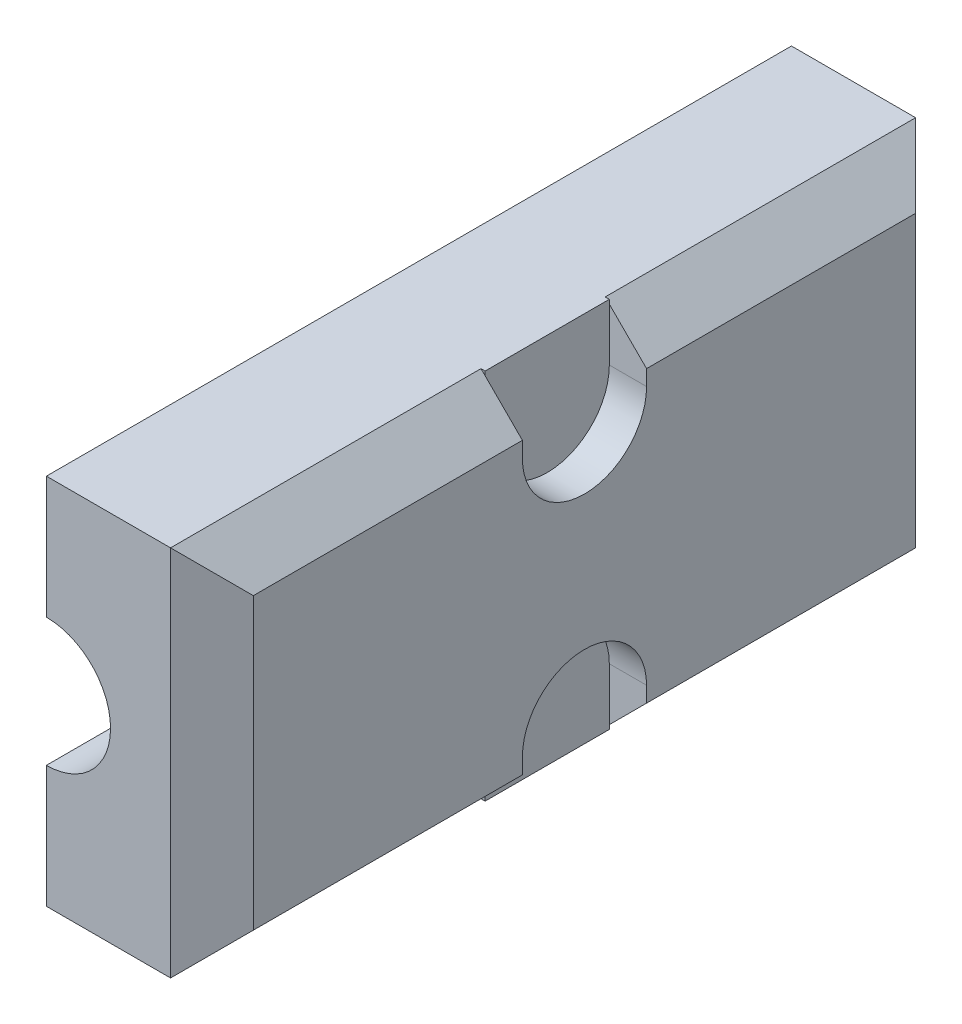
ISO-10303-21;
HEADER;
FILE_DESCRIPTION(('STEP AP214'),'2;1');
FILE_NAME('part.step','',(''),(''),'','','');
FILE_SCHEMA(('AUTOMOTIVE_DESIGN { 1 0 10303 214 1 1 1 1 }'));
ENDSEC;
DATA;
#1=APPLICATION_CONTEXT('core data for automotive mechanical design processes');
#2=APPLICATION_PROTOCOL_DEFINITION('international standard','automotive_design',2000,#1);
#3=PRODUCT_CONTEXT('',#1,'mechanical');
#4=PRODUCT('Part','Part','',(#3));
#5=PRODUCT_RELATED_PRODUCT_CATEGORY('part','',(#4));
#6=PRODUCT_DEFINITION_FORMATION('','',#4);
#7=PRODUCT_DEFINITION_CONTEXT('part definition',#1,'design');
#8=PRODUCT_DEFINITION('design','',#6,#7);
#9=PRODUCT_DEFINITION_SHAPE('','',#8);
#10=(LENGTH_UNIT() NAMED_UNIT(*) SI_UNIT(.MILLI.,.METRE.));
#11=(NAMED_UNIT(*) PLANE_ANGLE_UNIT() SI_UNIT($,.RADIAN.));
#12=(NAMED_UNIT(*) SI_UNIT($,.STERADIAN.) SOLID_ANGLE_UNIT());
#13=UNCERTAINTY_MEASURE_WITH_UNIT(LENGTH_MEASURE(1.E-05),#10,'distance_accuracy_value','');
#14=(GEOMETRIC_REPRESENTATION_CONTEXT(3) GLOBAL_UNCERTAINTY_ASSIGNED_CONTEXT((#13)) GLOBAL_UNIT_ASSIGNED_CONTEXT((#10,
#11,#12)) REPRESENTATION_CONTEXT('',''));
#15=CARTESIAN_POINT('',(0.,0.,0.));
#16=DIRECTION('',(0.,0.,1.));
#17=DIRECTION('',(1.,0.,0.));
#18=AXIS2_PLACEMENT_3D('',#15,#16,#17);
#19=CARTESIAN_POINT('',(8.,7.,0.));
#20=DIRECTION('',(-0.707106781186546,-0.707106781186549,0.));
#21=DIRECTION('',(0.,0.,1.));
#22=AXIS2_PLACEMENT_3D('',#19,#20,#21);
#23=PLANE('',#22);
#24=DIRECTION('',(0.,0.,1.));
#25=VECTOR('',#24,1.);
#26=CARTESIAN_POINT('',(8.,7.,0.));
#27=LINE('',#26,#25);
#28=CARTESIAN_POINT('',(8.,7.,2.99999999999994));
#29=VERTEX_POINT('',#28);
#30=CARTESIAN_POINT('',(8.,7.,16.));
#31=VERTEX_POINT('',#30);
#32=EDGE_CURVE('E290',#29,#31,#27,.T.);
#33=ORIENTED_EDGE('',*,*,#32,.F.);
#34=DIRECTION('',(0.707106781186549,-0.707106781186546,0.));
#35=VECTOR('',#34,1.);
#36=CARTESIAN_POINT('',(8.,7.,2.99999999999994));
#37=LINE('',#36,#35);
#38=CARTESIAN_POINT('',(6.2,8.79999999999999,2.99999999999994));
#39=VERTEX_POINT('',#38);
#40=EDGE_CURVE('E334',#29,#39,#37,.F.);
#41=ORIENTED_EDGE('',*,*,#40,.T.);
#42=CARTESIAN_POINT('',(6.,9.,2.99999999999994));
#43=VERTEX_POINT('',#42);
#44=EDGE_CURVE('E333',#39,#43,#37,.F.);
#45=ORIENTED_EDGE('',*,*,#44,.T.);
#46=DIRECTION('',(0.,0.,-1.));
#47=VECTOR('',#46,1.);
#48=CARTESIAN_POINT('',(5.99999999999999,9.,18.));
#49=LINE('',#48,#47);
#50=CARTESIAN_POINT('',(5.99999999999999,9.,18.));
#51=VERTEX_POINT('',#50);
#52=EDGE_CURVE('E312',#51,#43,#49,.T.);
#53=ORIENTED_EDGE('',*,*,#52,.F.);
#54=DIRECTION('',(0.577350269189627,-0.577350269189625,-0.577350269189625));
#55=VECTOR('',#54,1.);
#56=CARTESIAN_POINT('',(13.3333333333333,1.66666666666668,10.6666666666667));
#57=LINE('',#56,#55);
#58=EDGE_CURVE('E317',#31,#51,#57,.F.);
#59=ORIENTED_EDGE('',*,*,#58,.F.);
#60=EDGE_LOOP('',(#33,#41,#45,#53,#59));
#61=FACE_BOUND('',#60,.T.);
#62=ADVANCED_FACE('F38',(#61),#23,.F.);
#63=CARTESIAN_POINT('',(8.,-7.,0.));
#64=DIRECTION('',(-0.707106781186546,0.707106781186549,0.));
#65=DIRECTION('',(0.,0.,-1.));
#66=AXIS2_PLACEMENT_3D('',#63,#64,#65);
#67=PLANE('',#66);
#68=DIRECTION('',(0.,0.,-1.));
#69=VECTOR('',#68,1.);
#70=CARTESIAN_POINT('',(8.,-7.,0.));
#71=LINE('',#70,#69);
#72=CARTESIAN_POINT('',(8.,-7.,-3.00000000000006));
#73=VERTEX_POINT('',#72);
#74=CARTESIAN_POINT('',(8.,-7.,-16.));
#75=VERTEX_POINT('',#74);
#76=EDGE_CURVE('E296',#73,#75,#71,.T.);
#77=ORIENTED_EDGE('',*,*,#76,.F.);
#78=DIRECTION('',(0.707106781186549,0.707106781186546,0.));
#79=VECTOR('',#78,1.);
#80=CARTESIAN_POINT('',(8.,-7.,-3.00000000000006));
#81=LINE('',#80,#79);
#82=CARTESIAN_POINT('',(6.2,-8.79999999999999,-3.00000000000006));
#83=VERTEX_POINT('',#82);
#84=EDGE_CURVE('E328',#73,#83,#81,.F.);
#85=ORIENTED_EDGE('',*,*,#84,.T.);
#86=CARTESIAN_POINT('',(6.,-9.,-3.00000000000006));
#87=VERTEX_POINT('',#86);
#88=EDGE_CURVE('E315',#83,#87,#81,.F.);
#89=ORIENTED_EDGE('',*,*,#88,.T.);
#90=DIRECTION('',(0.,0.,1.));
#91=VECTOR('',#90,1.);
#92=CARTESIAN_POINT('',(5.99999999999999,-9.,18.));
#93=LINE('',#92,#91);
#94=CARTESIAN_POINT('',(5.99999999999999,-9.,-18.));
#95=VERTEX_POINT('',#94);
#96=EDGE_CURVE('E307',#95,#87,#93,.T.);
#97=ORIENTED_EDGE('',*,*,#96,.F.);
#98=DIRECTION('',(-0.577350269189627,-0.577350269189625,-0.577350269189625));
#99=VECTOR('',#98,1.);
#100=CARTESIAN_POINT('',(10.3333333333333,-4.66666666666667,-13.6666666666667));
#101=LINE('',#100,#99);
#102=EDGE_CURVE('E319',#95,#75,#101,.F.);
#103=ORIENTED_EDGE('',*,*,#102,.T.);
#104=EDGE_LOOP('',(#77,#85,#89,#97,#103));
#105=FACE_BOUND('',#104,.T.);
#106=ADVANCED_FACE('F403',(#105),#67,.F.);
#107=CARTESIAN_POINT('',(8.88178419700125E-13,-6.24999999999994,0.));
#108=DIRECTION('',(1.,0.,0.));
#109=DIRECTION('',(0.,0.,-1.));
#110=AXIS2_PLACEMENT_3D('',#107,#108,#109);
#111=CYLINDRICAL_SURFACE('',#110,2.);
#112=CARTESIAN_POINT('',(8.88178419700125E-13,-6.24999999999994,0.));
#113=DIRECTION('',(1.00000000000007,0.,0.));
#114=DIRECTION('',(0.,0.,-1.));
#115=AXIS2_PLACEMENT_3D('',#112,#113,#114);
#116=CIRCLE('',#115,2.);
#117=CARTESIAN_POINT('',(8.88178419700125E-13,-6.24999999999994,-2.00000000000002));
#118=VERTEX_POINT('',#117);
#119=EDGE_CURVE('E253',#118,#118,#116,.T.);
#120=ORIENTED_EDGE('',*,*,#119,.F.);
#121=EDGE_LOOP('',(#120));
#122=FACE_BOUND('',#121,.T.);
#123=CARTESIAN_POINT('',(6.,-6.24999999999994,0.));
#124=DIRECTION('',(1.,0.,0.));
#125=DIRECTION('',(0.,0.,-1.));
#126=AXIS2_PLACEMENT_3D('',#123,#124,#125);
#127=CIRCLE('',#126,2.);
#128=CARTESIAN_POINT('',(6.,-6.24999999999994,-2.00000000000002));
#129=VERTEX_POINT('',#128);
#130=EDGE_CURVE('E256',#129,#129,#127,.F.);
#131=ORIENTED_EDGE('',*,*,#130,.F.);
#132=EDGE_LOOP('',(#131));
#133=FACE_BOUND('',#132,.T.);
#134=ADVANCED_FACE('F429',(#122,#133),#111,.F.);
#135=CARTESIAN_POINT('',(0.,6.25000000000007,0.));
#136=DIRECTION('',(1.,0.,0.));
#137=DIRECTION('',(0.,0.,-1.));
#138=AXIS2_PLACEMENT_3D('',#135,#136,#137);
#139=CYLINDRICAL_SURFACE('',#138,2.);
#140=CARTESIAN_POINT('',(0.,6.25000000000007,0.));
#141=DIRECTION('',(1.00000000000001,0.,0.));
#142=DIRECTION('',(0.,0.,-1.));
#143=AXIS2_PLACEMENT_3D('',#140,#141,#142);
#144=CIRCLE('',#143,2.);
#145=CARTESIAN_POINT('',(0.,6.25000000000007,-2.00000000000006));
#146=VERTEX_POINT('',#145);
#147=EDGE_CURVE('E249',#146,#146,#144,.T.);
#148=ORIENTED_EDGE('',*,*,#147,.F.);
#149=EDGE_LOOP('',(#148));
#150=FACE_BOUND('',#149,.T.);
#151=CARTESIAN_POINT('',(6.,6.25000000000007,0.));
#152=DIRECTION('',(1.,0.,0.));
#153=DIRECTION('',(0.,0.,-1.));
#154=AXIS2_PLACEMENT_3D('',#151,#152,#153);
#155=CIRCLE('',#154,2.);
#156=CARTESIAN_POINT('',(6.,6.25000000000007,-2.00000000000006));
#157=VERTEX_POINT('',#156);
#158=EDGE_CURVE('E237',#157,#157,#155,.F.);
#159=ORIENTED_EDGE('',*,*,#158,.F.);
#160=EDGE_LOOP('',(#159));
#161=FACE_BOUND('',#160,.T.);
#162=ADVANCED_FACE('F572',(#150,#161),#139,.F.);
#163=CARTESIAN_POINT('',(0.,0.,0.));
#164=DIRECTION('',(-1.,0.,0.));
#165=DIRECTION('',(0.,0.,1.));
#166=AXIS2_PLACEMENT_3D('',#163,#164,#165);
#167=PLANE('',#166);
#168=ORIENTED_EDGE('',*,*,#119,.T.);
#169=EDGE_LOOP('',(#168));
#170=FACE_BOUND('',#169,.T.);
#171=DIRECTION('',(0.,0.,1.));
#172=VECTOR('',#171,1.);
#173=CARTESIAN_POINT('',(0.,-3.1,-18.));
#174=LINE('',#173,#172);
#175=CARTESIAN_POINT('',(0.,-3.1,-18.));
#176=VERTEX_POINT('',#175);
#177=CARTESIAN_POINT('',(0.,-3.1,18.));
#178=VERTEX_POINT('',#177);
#179=EDGE_CURVE('E260',#176,#178,#174,.T.);
#180=ORIENTED_EDGE('',*,*,#179,.F.);
#181=DIRECTION('',(0.,1.,0.));
#182=VECTOR('',#181,1.);
#183=CARTESIAN_POINT('',(0.,-9.,-18.));
#184=LINE('',#183,#182);
#185=CARTESIAN_POINT('',(0.,-9.,-18.));
#186=VERTEX_POINT('',#185);
#187=EDGE_CURVE('E269',#186,#176,#184,.T.);
#188=ORIENTED_EDGE('',*,*,#187,.F.);
#189=DIRECTION('',(0.,0.,-1.));
#190=VECTOR('',#189,1.);
#191=CARTESIAN_POINT('',(0.,-9.,18.));
#192=LINE('',#191,#190);
#193=CARTESIAN_POINT('',(0.,-9.,18.));
#194=VERTEX_POINT('',#193);
#195=EDGE_CURVE('E279',#194,#186,#192,.T.);
#196=ORIENTED_EDGE('',*,*,#195,.F.);
#197=DIRECTION('',(0.,-1.,0.));
#198=VECTOR('',#197,1.);
#199=CARTESIAN_POINT('',(0.,-9.,18.));
#200=LINE('',#199,#198);
#201=EDGE_CURVE('E275',#178,#194,#200,.T.);
#202=ORIENTED_EDGE('',*,*,#201,.F.);
#203=EDGE_LOOP('',(#180,#188,#196,#202));
#204=FACE_BOUND('',#203,.T.);
#205=ADVANCED_FACE('F449',(#170,#204),#167,.T.);
#206=CARTESIAN_POINT('',(8.,-9.,-18.));
#207=DIRECTION('',(0.,0.,1.));
#208=DIRECTION('',(1.,0.,0.));
#209=AXIS2_PLACEMENT_3D('',#206,#207,#208);
#210=PLANE('',#209);
#211=DIRECTION('',(-1.,0.,0.));
#212=VECTOR('',#211,1.);
#213=CARTESIAN_POINT('',(8.,9.,-18.));
#214=LINE('',#213,#212);
#215=CARTESIAN_POINT('',(5.99999999999999,9.,-18.));
#216=VERTEX_POINT('',#215);
#217=CARTESIAN_POINT('',(0.,9.,-18.));
#218=VERTEX_POINT('',#217);
#219=EDGE_CURVE('E288',#216,#218,#214,.T.);
#220=ORIENTED_EDGE('',*,*,#219,.F.);
#221=DIRECTION('',(0.,-1.,0.));
#222=VECTOR('',#221,1.);
#223=CARTESIAN_POINT('',(5.99999999999999,-9.,-18.));
#224=LINE('',#223,#222);
#225=EDGE_CURVE('E309',#216,#95,#224,.T.);
#226=ORIENTED_EDGE('',*,*,#225,.T.);
#227=DIRECTION('',(-1.,0.,0.));
#228=VECTOR('',#227,1.);
#229=CARTESIAN_POINT('',(8.,-9.,-18.));
#230=LINE('',#229,#228);
#231=EDGE_CURVE('E282',#95,#186,#230,.T.);
#232=ORIENTED_EDGE('',*,*,#231,.T.);
#233=ORIENTED_EDGE('',*,*,#187,.T.);
#234=CARTESIAN_POINT('',(0.,0.,-18.));
#235=DIRECTION('',(0.,0.,1.));
#236=DIRECTION('',(1.,0.,0.));
#237=AXIS2_PLACEMENT_3D('',#234,#235,#236);
#238=CIRCLE('',#237,3.1);
#239=CARTESIAN_POINT('',(0.,3.1,-18.));
#240=VERTEX_POINT('',#239);
#241=EDGE_CURVE('E257',#176,#240,#238,.T.);
#242=ORIENTED_EDGE('',*,*,#241,.T.);
#243=EDGE_CURVE('E267',#240,#218,#184,.T.);
#244=ORIENTED_EDGE('',*,*,#243,.T.);
#245=EDGE_LOOP('',(#220,#226,#232,#233,#242,#244));
#246=FACE_BOUND('',#245,.T.);
#247=ADVANCED_FACE('F391',(#246),#210,.F.);
#248=CARTESIAN_POINT('',(8.,9.,18.));
#249=DIRECTION('',(0.,-1.,0.));
#250=DIRECTION('',(0.,0.,-1.));
#251=AXIS2_PLACEMENT_3D('',#248,#249,#250);
#252=PLANE('',#251);
#253=DIRECTION('',(-1.,0.,0.));
#254=VECTOR('',#253,1.);
#255=CARTESIAN_POINT('',(8.,9.,18.));
#256=LINE('',#255,#254);
#257=CARTESIAN_POINT('',(0.,9.,18.));
#258=VERTEX_POINT('',#257);
#259=EDGE_CURVE('E286',#51,#258,#256,.T.);
#260=ORIENTED_EDGE('',*,*,#259,.F.);
#261=ORIENTED_EDGE('',*,*,#52,.T.);
#262=DIRECTION('',(-1.,0.,0.));
#263=VECTOR('',#262,1.);
#264=CARTESIAN_POINT('',(6.2,9.,2.99999999999994));
#265=LINE('',#264,#263);
#266=CARTESIAN_POINT('',(6.2,9.,2.99999999999994));
#267=VERTEX_POINT('',#266);
#268=EDGE_CURVE('E216',#267,#43,#265,.T.);
#269=ORIENTED_EDGE('',*,*,#268,.F.);
#270=DIRECTION('',(0.,0.,1.));
#271=VECTOR('',#270,1.);
#272=CARTESIAN_POINT('',(6.2,9.,-3.00000000000007));
#273=LINE('',#272,#271);
#274=CARTESIAN_POINT('',(6.2,9.,-3.00000000000007));
#275=VERTEX_POINT('',#274);
#276=EDGE_CURVE('E208',#275,#267,#273,.T.);
#277=ORIENTED_EDGE('',*,*,#276,.F.);
#278=DIRECTION('',(-1.,0.,0.));
#279=VECTOR('',#278,1.);
#280=CARTESIAN_POINT('',(6.2,9.,-3.00000000000007));
#281=LINE('',#280,#279);
#282=CARTESIAN_POINT('',(5.99999999999999,9.,-3.00000000000007));
#283=VERTEX_POINT('',#282);
#284=EDGE_CURVE('E219',#275,#283,#281,.T.);
#285=ORIENTED_EDGE('',*,*,#284,.T.);
#286=EDGE_CURVE('E311',#283,#216,#49,.T.);
#287=ORIENTED_EDGE('',*,*,#286,.T.);
#288=ORIENTED_EDGE('',*,*,#219,.T.);
#289=DIRECTION('',(0.,0.,1.));
#290=VECTOR('',#289,1.);
#291=CARTESIAN_POINT('',(0.,9.,18.));
#292=LINE('',#291,#290);
#293=EDGE_CURVE('E272',#218,#258,#292,.T.);
#294=ORIENTED_EDGE('',*,*,#293,.T.);
#295=EDGE_LOOP('',(#260,#261,#269,#277,#285,#287,#288,#294));
#296=FACE_BOUND('',#295,.T.);
#297=ADVANCED_FACE('F358',(#296),#252,.F.);
#298=CARTESIAN_POINT('',(8.,-9.,18.));
#299=DIRECTION('',(0.,0.,-1.));
#300=DIRECTION('',(-1.,0.,0.));
#301=AXIS2_PLACEMENT_3D('',#298,#299,#300);
#302=PLANE('',#301);
#303=DIRECTION('',(-1.,0.,0.));
#304=VECTOR('',#303,1.);
#305=CARTESIAN_POINT('',(8.,-9.,18.));
#306=LINE('',#305,#304);
#307=CARTESIAN_POINT('',(5.99999999999999,-9.,18.));
#308=VERTEX_POINT('',#307);
#309=EDGE_CURVE('E284',#308,#194,#306,.T.);
#310=ORIENTED_EDGE('',*,*,#309,.F.);
#311=DIRECTION('',(0.,1.,0.));
#312=VECTOR('',#311,1.);
#313=CARTESIAN_POINT('',(5.99999999999999,-9.,18.));
#314=LINE('',#313,#312);
#315=EDGE_CURVE('E303',#308,#51,#314,.T.);
#316=ORIENTED_EDGE('',*,*,#315,.T.);
#317=ORIENTED_EDGE('',*,*,#259,.T.);
#318=CARTESIAN_POINT('',(0.,3.1,18.));
#319=VERTEX_POINT('',#318);
#320=EDGE_CURVE('E276',#258,#319,#200,.T.);
#321=ORIENTED_EDGE('',*,*,#320,.T.);
#322=CARTESIAN_POINT('',(0.,0.,18.));
#323=DIRECTION('',(0.,0.,1.));
#324=DIRECTION('',(1.,0.,0.));
#325=AXIS2_PLACEMENT_3D('',#322,#323,#324);
#326=CIRCLE('',#325,3.1);
#327=EDGE_CURVE('E261',#178,#319,#326,.T.);
#328=ORIENTED_EDGE('',*,*,#327,.F.);
#329=ORIENTED_EDGE('',*,*,#201,.T.);
#330=EDGE_LOOP('',(#310,#316,#317,#321,#328,#329));
#331=FACE_BOUND('',#330,.T.);
#332=ADVANCED_FACE('F364',(#331),#302,.F.);
#333=CARTESIAN_POINT('',(8.,-9.,18.));
#334=DIRECTION('',(0.,1.,0.));
#335=DIRECTION('',(0.,0.,1.));
#336=AXIS2_PLACEMENT_3D('',#333,#334,#335);
#337=PLANE('',#336);
#338=ORIENTED_EDGE('',*,*,#231,.F.);
#339=ORIENTED_EDGE('',*,*,#96,.T.);
#340=DIRECTION('',(-1.,0.,0.));
#341=VECTOR('',#340,1.);
#342=CARTESIAN_POINT('',(6.2,-9.,-3.00000000000006));
#343=LINE('',#342,#341);
#344=CARTESIAN_POINT('',(6.2,-9.,-3.00000000000006));
#345=VERTEX_POINT('',#344);
#346=EDGE_CURVE('E193',#345,#87,#343,.T.);
#347=ORIENTED_EDGE('',*,*,#346,.F.);
#348=DIRECTION('',(0.,0.,-1.));
#349=VECTOR('',#348,1.);
#350=CARTESIAN_POINT('',(6.2,-9.,2.99999999999998));
#351=LINE('',#350,#349);
#352=CARTESIAN_POINT('',(6.2,-9.,2.99999999999998));
#353=VERTEX_POINT('',#352);
#354=EDGE_CURVE('E180',#353,#345,#351,.T.);
#355=ORIENTED_EDGE('',*,*,#354,.F.);
#356=DIRECTION('',(-1.,0.,0.));
#357=VECTOR('',#356,1.);
#358=CARTESIAN_POINT('',(6.2,-9.,2.99999999999998));
#359=LINE('',#358,#357);
#360=CARTESIAN_POINT('',(5.99999999999999,-9.,2.99999999999998));
#361=VERTEX_POINT('',#360);
#362=EDGE_CURVE('E190',#353,#361,#359,.T.);
#363=ORIENTED_EDGE('',*,*,#362,.T.);
#364=EDGE_CURVE('E306',#361,#308,#93,.T.);
#365=ORIENTED_EDGE('',*,*,#364,.T.);
#366=ORIENTED_EDGE('',*,*,#309,.T.);
#367=ORIENTED_EDGE('',*,*,#195,.T.);
#368=EDGE_LOOP('',(#338,#339,#347,#355,#363,#365,#366,#367));
#369=FACE_BOUND('',#368,.T.);
#370=ADVANCED_FACE('F189',(#369),#337,.F.);
#371=CARTESIAN_POINT('',(8.,0.,0.));
#372=DIRECTION('',(-1.,0.,0.));
#373=DIRECTION('',(0.,0.,1.));
#374=AXIS2_PLACEMENT_3D('',#371,#372,#373);
#375=PLANE('',#374);
#376=CARTESIAN_POINT('',(8.,7.,-16.));
#377=VERTEX_POINT('',#376);
#378=CARTESIAN_POINT('',(8.,7.,-3.00000000000006));
#379=VERTEX_POINT('',#378);
#380=EDGE_CURVE('E291',#377,#379,#27,.T.);
#381=ORIENTED_EDGE('',*,*,#380,.T.);
#382=DIRECTION('',(0.,1.,0.));
#383=VECTOR('',#382,1.);
#384=CARTESIAN_POINT('',(8.,0.,-3.00000000000006));
#385=LINE('',#384,#383);
#386=CARTESIAN_POINT('',(8.,6.25000000000006,-3.00000000000006));
#387=VERTEX_POINT('',#386);
#388=EDGE_CURVE('E232',#387,#379,#385,.T.);
#389=ORIENTED_EDGE('',*,*,#388,.F.);
#390=CARTESIAN_POINT('',(8.,6.25000000000006,0.));
#391=DIRECTION('',(1.,0.,0.));
#392=DIRECTION('',(0.,0.,-1.));
#393=AXIS2_PLACEMENT_3D('',#390,#391,#392);
#394=CIRCLE('',#393,3.);
#395=CARTESIAN_POINT('',(8.,6.25000000000006,2.99999999999994));
#396=VERTEX_POINT('',#395);
#397=EDGE_CURVE('E228',#396,#387,#394,.T.);
#398=ORIENTED_EDGE('',*,*,#397,.F.);
#399=DIRECTION('',(0.,1.,0.));
#400=VECTOR('',#399,1.);
#401=CARTESIAN_POINT('',(8.,0.,2.99999999999994));
#402=LINE('',#401,#400);
#403=EDGE_CURVE('E225',#396,#29,#402,.T.);
#404=ORIENTED_EDGE('',*,*,#403,.T.);
#405=ORIENTED_EDGE('',*,*,#32,.T.);
#406=DIRECTION('',(0.,-1.,0.));
#407=VECTOR('',#406,1.);
#408=CARTESIAN_POINT('',(8.,0.,16.));
#409=LINE('',#408,#407);
#410=CARTESIAN_POINT('',(8.,-7.,16.));
#411=VERTEX_POINT('',#410);
#412=EDGE_CURVE('E300',#31,#411,#409,.T.);
#413=ORIENTED_EDGE('',*,*,#412,.T.);
#414=CARTESIAN_POINT('',(8.,-7.,2.99999999999994));
#415=VERTEX_POINT('',#414);
#416=EDGE_CURVE('E297',#411,#415,#71,.T.);
#417=ORIENTED_EDGE('',*,*,#416,.T.);
#418=DIRECTION('',(0.,-1.,0.));
#419=VECTOR('',#418,1.);
#420=CARTESIAN_POINT('',(8.,0.,2.99999999999994));
#421=LINE('',#420,#419);
#422=CARTESIAN_POINT('',(8.,-6.25000000000006,2.99999999999996));
#423=VERTEX_POINT('',#422);
#424=EDGE_CURVE('E244',#423,#415,#421,.T.);
#425=ORIENTED_EDGE('',*,*,#424,.F.);
#426=CARTESIAN_POINT('',(8.,-6.24999999999994,0.));
#427=DIRECTION('',(1.,0.,0.));
#428=DIRECTION('',(0.,0.,-1.));
#429=AXIS2_PLACEMENT_3D('',#426,#427,#428);
#430=CIRCLE('',#429,3.);
#431=CARTESIAN_POINT('',(8.,-6.25000000000006,-3.00000000000004));
#432=VERTEX_POINT('',#431);
#433=EDGE_CURVE('E241',#432,#423,#430,.T.);
#434=ORIENTED_EDGE('',*,*,#433,.F.);
#435=DIRECTION('',(0.,-1.,0.));
#436=VECTOR('',#435,1.);
#437=CARTESIAN_POINT('',(8.,0.,-3.00000000000006));
#438=LINE('',#437,#436);
#439=EDGE_CURVE('E224',#432,#73,#438,.T.);
#440=ORIENTED_EDGE('',*,*,#439,.T.);
#441=ORIENTED_EDGE('',*,*,#76,.T.);
#442=DIRECTION('',(0.,1.,0.));
#443=VECTOR('',#442,1.);
#444=CARTESIAN_POINT('',(8.,0.,-16.));
#445=LINE('',#444,#443);
#446=EDGE_CURVE('E294',#75,#377,#445,.T.);
#447=ORIENTED_EDGE('',*,*,#446,.T.);
#448=EDGE_LOOP('',(#381,#389,#398,#404,#405,#413,#417,#425,#434,#440,#441,#447));
#449=FACE_BOUND('',#448,.T.);
#450=ADVANCED_FACE('F373',(#449),#375,.F.);
#451=ORIENTED_EDGE('',*,*,#147,.T.);
#452=EDGE_LOOP('',(#451));
#453=FACE_BOUND('',#452,.T.);
#454=DIRECTION('',(0.,0.,1.));
#455=VECTOR('',#454,1.);
#456=CARTESIAN_POINT('',(0.,3.1,-18.));
#457=LINE('',#456,#455);
#458=EDGE_CURVE('E264',#240,#319,#457,.T.);
#459=ORIENTED_EDGE('',*,*,#458,.T.);
#460=ORIENTED_EDGE('',*,*,#320,.F.);
#461=ORIENTED_EDGE('',*,*,#293,.F.);
#462=ORIENTED_EDGE('',*,*,#243,.F.);
#463=EDGE_LOOP('',(#459,#460,#461,#462));
#464=FACE_BOUND('',#463,.T.);
#465=ADVANCED_FACE('F441',(#453,#464),#167,.T.);
#466=CARTESIAN_POINT('',(0.,0.,-18.));
#467=DIRECTION('',(0.,0.,1.));
#468=DIRECTION('',(1.,0.,0.));
#469=AXIS2_PLACEMENT_3D('',#466,#467,#468);
#470=CYLINDRICAL_SURFACE('',#469,3.1);
#471=ORIENTED_EDGE('',*,*,#327,.T.);
#472=ORIENTED_EDGE('',*,*,#458,.F.);
#473=ORIENTED_EDGE('',*,*,#241,.F.);
#474=ORIENTED_EDGE('',*,*,#179,.T.);
#475=EDGE_LOOP('',(#471,#472,#473,#474));
#476=FACE_BOUND('',#475,.T.);
#477=ADVANCED_FACE('F437',(#476),#470,.F.);
#478=CARTESIAN_POINT('',(8.,0.,-16.));
#479=DIRECTION('',(-0.707106781186546,0.,0.707106781186549));
#480=DIRECTION('',(0.,1.,0.));
#481=AXIS2_PLACEMENT_3D('',#478,#479,#480);
#482=PLANE('',#481);
#483=ORIENTED_EDGE('',*,*,#102,.F.);
#484=ORIENTED_EDGE('',*,*,#225,.F.);
#485=DIRECTION('',(-0.577350269189627,0.577350269189625,-0.577350269189625));
#486=VECTOR('',#485,1.);
#487=CARTESIAN_POINT('',(13.3333333333333,1.66666666666668,-10.6666666666667));
#488=LINE('',#487,#486);
#489=EDGE_CURVE('E263',#377,#216,#488,.T.);
#490=ORIENTED_EDGE('',*,*,#489,.F.);
#491=ORIENTED_EDGE('',*,*,#446,.F.);
#492=EDGE_LOOP('',(#483,#484,#490,#491));
#493=FACE_BOUND('',#492,.T.);
#494=ADVANCED_FACE('F41',(#493),#482,.F.);
#495=DIRECTION('',(0.707106781186549,-0.707106781186546,0.));
#496=VECTOR('',#495,1.);
#497=CARTESIAN_POINT('',(8.,7.,-3.00000000000006));
#498=LINE('',#497,#496);
#499=CARTESIAN_POINT('',(6.2,8.79999999999999,-3.00000000000006));
#500=VERTEX_POINT('',#499);
#501=EDGE_CURVE('E337',#379,#500,#498,.F.);
#502=ORIENTED_EDGE('',*,*,#501,.F.);
#503=ORIENTED_EDGE('',*,*,#380,.F.);
#504=ORIENTED_EDGE('',*,*,#489,.T.);
#505=ORIENTED_EDGE('',*,*,#286,.F.);
#506=DIRECTION('',(-0.707106781186549,0.707106781186546,0.));
#507=VECTOR('',#506,1.);
#508=CARTESIAN_POINT('',(8.,7.,-3.00000000000006));
#509=LINE('',#508,#507);
#510=EDGE_CURVE('E222',#283,#500,#509,.F.);
#511=ORIENTED_EDGE('',*,*,#510,.T.);
#512=EDGE_LOOP('',(#502,#503,#504,#505,#511));
#513=FACE_BOUND('',#512,.T.);
#514=ADVANCED_FACE('F400',(#513),#23,.F.);
#515=DIRECTION('',(0.707106781186549,0.707106781186546,0.));
#516=VECTOR('',#515,1.);
#517=CARTESIAN_POINT('',(8.,-7.,2.99999999999994));
#518=LINE('',#517,#516);
#519=CARTESIAN_POINT('',(6.2,-8.79999999999999,2.99999999999994));
#520=VERTEX_POINT('',#519);
#521=EDGE_CURVE('E331',#415,#520,#518,.F.);
#522=ORIENTED_EDGE('',*,*,#521,.F.);
#523=ORIENTED_EDGE('',*,*,#416,.F.);
#524=DIRECTION('',(-0.577350269189627,-0.577350269189625,0.577350269189625));
#525=VECTOR('',#524,1.);
#526=CARTESIAN_POINT('',(13.3333333333333,-1.66666666666668,10.6666666666667));
#527=LINE('',#526,#525);
#528=EDGE_CURVE('E252',#308,#411,#527,.F.);
#529=ORIENTED_EDGE('',*,*,#528,.F.);
#530=ORIENTED_EDGE('',*,*,#364,.F.);
#531=DIRECTION('',(-0.707106781186549,-0.707106781186546,0.));
#532=VECTOR('',#531,1.);
#533=CARTESIAN_POINT('',(8.,-7.,2.99999999999998));
#534=LINE('',#533,#532);
#535=EDGE_CURVE('E54',#361,#520,#534,.F.);
#536=ORIENTED_EDGE('',*,*,#535,.T.);
#537=EDGE_LOOP('',(#522,#523,#529,#530,#536));
#538=FACE_BOUND('',#537,.T.);
#539=ADVANCED_FACE('F370',(#538),#67,.F.);
#540=CARTESIAN_POINT('',(8.,0.,16.));
#541=DIRECTION('',(-0.707106781186546,0.,-0.707106781186549));
#542=DIRECTION('',(0.,-1.,0.));
#543=AXIS2_PLACEMENT_3D('',#540,#541,#542);
#544=PLANE('',#543);
#545=ORIENTED_EDGE('',*,*,#58,.T.);
#546=ORIENTED_EDGE('',*,*,#315,.F.);
#547=ORIENTED_EDGE('',*,*,#528,.T.);
#548=ORIENTED_EDGE('',*,*,#412,.F.);
#549=EDGE_LOOP('',(#545,#546,#547,#548));
#550=FACE_BOUND('',#549,.T.);
#551=ADVANCED_FACE('F368',(#550),#544,.F.);
#552=CARTESIAN_POINT('',(6.,0.,-3.00000000000006));
#553=DIRECTION('',(0.,0.,-1.));
#554=DIRECTION('',(0.,1.,0.));
#555=AXIS2_PLACEMENT_3D('',#552,#553,#554);
#556=PLANE('',#555);
#557=ORIENTED_EDGE('',*,*,#501,.T.);
#558=DIRECTION('',(0.,1.,0.));
#559=VECTOR('',#558,1.);
#560=CARTESIAN_POINT('',(6.2,6.25000000000006,-3.00000000000006));
#561=LINE('',#560,#559);
#562=CARTESIAN_POINT('',(6.2,6.25000000000006,-3.00000000000006));
#563=VERTEX_POINT('',#562);
#564=EDGE_CURVE('E205',#563,#500,#561,.T.);
#565=ORIENTED_EDGE('',*,*,#564,.F.);
#566=DIRECTION('',(1.,0.,0.));
#567=VECTOR('',#566,1.);
#568=CARTESIAN_POINT('',(6.,6.25000000000006,-3.00000000000006));
#569=LINE('',#568,#567);
#570=EDGE_CURVE('E235',#563,#387,#569,.T.);
#571=ORIENTED_EDGE('',*,*,#570,.T.);
#572=ORIENTED_EDGE('',*,*,#388,.T.);
#573=EDGE_LOOP('',(#557,#565,#571,#572));
#574=FACE_BOUND('',#573,.T.);
#575=ADVANCED_FACE('F380',(#574),#556,.F.);
#576=CARTESIAN_POINT('',(6.,6.25000000000006,0.));
#577=DIRECTION('',(1.,0.,0.));
#578=DIRECTION('',(0.,0.,-1.));
#579=AXIS2_PLACEMENT_3D('',#576,#577,#578);
#580=CYLINDRICAL_SURFACE('',#579,3.);
#581=ORIENTED_EDGE('',*,*,#570,.F.);
#582=CARTESIAN_POINT('',(6.2,6.25000000000006,0.));
#583=DIRECTION('',(1.,0.,0.));
#584=DIRECTION('',(0.,0.,-1.));
#585=AXIS2_PLACEMENT_3D('',#582,#583,#584);
#586=CIRCLE('',#585,3.);
#587=CARTESIAN_POINT('',(6.2,6.25000000000006,2.99999999999994));
#588=VERTEX_POINT('',#587);
#589=EDGE_CURVE('E213',#588,#563,#586,.T.);
#590=ORIENTED_EDGE('',*,*,#589,.F.);
#591=DIRECTION('',(1.,0.,0.));
#592=VECTOR('',#591,1.);
#593=CARTESIAN_POINT('',(6.,6.25000000000006,2.99999999999994));
#594=LINE('',#593,#592);
#595=EDGE_CURVE('E234',#588,#396,#594,.T.);
#596=ORIENTED_EDGE('',*,*,#595,.T.);
#597=ORIENTED_EDGE('',*,*,#397,.T.);
#598=EDGE_LOOP('',(#581,#590,#596,#597));
#599=FACE_BOUND('',#598,.T.);
#600=ADVANCED_FACE('F378',(#599),#580,.F.);
#601=CARTESIAN_POINT('',(6.,0.,2.99999999999994));
#602=DIRECTION('',(0.,0.,-1.));
#603=DIRECTION('',(-1.,0.,0.));
#604=AXIS2_PLACEMENT_3D('',#601,#602,#603);
#605=PLANE('',#604);
#606=DIRECTION('',(0.,-1.,0.));
#607=VECTOR('',#606,1.);
#608=CARTESIAN_POINT('',(6.2,0.,2.99999999999994));
#609=LINE('',#608,#607);
#610=EDGE_CURVE('E47',#39,#588,#609,.T.);
#611=ORIENTED_EDGE('',*,*,#610,.F.);
#612=ORIENTED_EDGE('',*,*,#40,.F.);
#613=ORIENTED_EDGE('',*,*,#403,.F.);
#614=ORIENTED_EDGE('',*,*,#595,.F.);
#615=EDGE_LOOP('',(#611,#612,#613,#614));
#616=FACE_BOUND('',#615,.T.);
#617=ADVANCED_FACE('F345',(#616),#605,.T.);
#618=CARTESIAN_POINT('',(6.,0.,2.99999999999994));
#619=DIRECTION('',(0.,0.,1.));
#620=DIRECTION('',(1.,0.,0.));
#621=AXIS2_PLACEMENT_3D('',#618,#619,#620);
#622=PLANE('',#621);
#623=ORIENTED_EDGE('',*,*,#521,.T.);
#624=DIRECTION('',(0.,-1.,0.));
#625=VECTOR('',#624,1.);
#626=CARTESIAN_POINT('',(6.2,-6.25000000000006,2.99999999999998));
#627=LINE('',#626,#625);
#628=CARTESIAN_POINT('',(6.2,-6.25000000000006,2.99999999999996));
#629=VERTEX_POINT('',#628);
#630=EDGE_CURVE('E61',#629,#520,#627,.T.);
#631=ORIENTED_EDGE('',*,*,#630,.F.);
#632=DIRECTION('',(1.,0.,0.));
#633=VECTOR('',#632,1.);
#634=CARTESIAN_POINT('',(6.,-6.25000000000006,2.99999999999996));
#635=LINE('',#634,#633);
#636=EDGE_CURVE('E229',#629,#423,#635,.T.);
#637=ORIENTED_EDGE('',*,*,#636,.T.);
#638=ORIENTED_EDGE('',*,*,#424,.T.);
#639=EDGE_LOOP('',(#623,#631,#637,#638));
#640=FACE_BOUND('',#639,.T.);
#641=ADVANCED_FACE('F413',(#640),#622,.F.);
#642=CARTESIAN_POINT('',(6.,-6.24999999999994,0.));
#643=DIRECTION('',(1.,0.,0.));
#644=DIRECTION('',(0.,0.,-1.));
#645=AXIS2_PLACEMENT_3D('',#642,#643,#644);
#646=CYLINDRICAL_SURFACE('',#645,3.);
#647=ORIENTED_EDGE('',*,*,#636,.F.);
#648=CARTESIAN_POINT('',(6.2,-6.24999999999994,0.));
#649=DIRECTION('',(1.,0.,0.));
#650=DIRECTION('',(0.,0.,-1.));
#651=AXIS2_PLACEMENT_3D('',#648,#649,#650);
#652=CIRCLE('',#651,3.00000000000001);
#653=CARTESIAN_POINT('',(6.2,-6.25000000000006,-3.00000000000004));
#654=VERTEX_POINT('',#653);
#655=EDGE_CURVE('E201',#654,#629,#652,.T.);
#656=ORIENTED_EDGE('',*,*,#655,.F.);
#657=DIRECTION('',(1.,0.,0.));
#658=VECTOR('',#657,1.);
#659=CARTESIAN_POINT('',(6.,-6.25000000000006,-3.00000000000004));
#660=LINE('',#659,#658);
#661=EDGE_CURVE('E246',#654,#432,#660,.T.);
#662=ORIENTED_EDGE('',*,*,#661,.T.);
#663=ORIENTED_EDGE('',*,*,#433,.T.);
#664=EDGE_LOOP('',(#647,#656,#662,#663));
#665=FACE_BOUND('',#664,.T.);
#666=ADVANCED_FACE('F410',(#665),#646,.F.);
#667=CARTESIAN_POINT('',(6.,0.,-3.00000000000006));
#668=DIRECTION('',(0.,0.,1.));
#669=DIRECTION('',(0.,-1.,0.));
#670=AXIS2_PLACEMENT_3D('',#667,#668,#669);
#671=PLANE('',#670);
#672=DIRECTION('',(0.,1.,0.));
#673=VECTOR('',#672,1.);
#674=CARTESIAN_POINT('',(6.2,0.,-3.00000000000006));
#675=LINE('',#674,#673);
#676=EDGE_CURVE('E11',#83,#654,#675,.T.);
#677=ORIENTED_EDGE('',*,*,#676,.F.);
#678=ORIENTED_EDGE('',*,*,#84,.F.);
#679=ORIENTED_EDGE('',*,*,#439,.F.);
#680=ORIENTED_EDGE('',*,*,#661,.F.);
#681=EDGE_LOOP('',(#677,#678,#679,#680));
#682=FACE_BOUND('',#681,.T.);
#683=ADVANCED_FACE('F415',(#682),#671,.T.);
#684=CARTESIAN_POINT('',(6.2,6.25000000000006,0.));
#685=DIRECTION('',(1.,0.,0.));
#686=DIRECTION('',(0.,0.,-1.));
#687=AXIS2_PLACEMENT_3D('',#684,#685,#686);
#688=PLANE('',#687);
#689=ORIENTED_EDGE('',*,*,#564,.T.);
#690=EDGE_CURVE('E199',#500,#275,#561,.T.);
#691=ORIENTED_EDGE('',*,*,#690,.T.);
#692=ORIENTED_EDGE('',*,*,#276,.T.);
#693=DIRECTION('',(0.,-1.,0.));
#694=VECTOR('',#693,1.);
#695=CARTESIAN_POINT('',(6.2,9.,2.99999999999994));
#696=LINE('',#695,#694);
#697=EDGE_CURVE('E210',#267,#39,#696,.T.);
#698=ORIENTED_EDGE('',*,*,#697,.T.);
#699=ORIENTED_EDGE('',*,*,#610,.T.);
#700=ORIENTED_EDGE('',*,*,#589,.T.);
#701=EDGE_LOOP('',(#689,#691,#692,#698,#699,#700));
#702=FACE_BOUND('',#701,.T.);
#703=ADVANCED_FACE('F341',(#702),#688,.T.);
#704=CARTESIAN_POINT('',(6.2,9.,2.99999999999994));
#705=DIRECTION('',(0.,0.,-1.));
#706=DIRECTION('',(-1.,0.,0.));
#707=AXIS2_PLACEMENT_3D('',#704,#705,#706);
#708=PLANE('',#707);
#709=ORIENTED_EDGE('',*,*,#44,.F.);
#710=ORIENTED_EDGE('',*,*,#697,.F.);
#711=ORIENTED_EDGE('',*,*,#268,.T.);
#712=EDGE_LOOP('',(#709,#710,#711));
#713=FACE_BOUND('',#712,.T.);
#714=ADVANCED_FACE('F353',(#713),#708,.F.);
#715=CARTESIAN_POINT('',(6.2,6.25000000000006,-3.00000000000006));
#716=DIRECTION('',(0.,0.,1.));
#717=DIRECTION('',(0.,-1.,0.));
#718=AXIS2_PLACEMENT_3D('',#715,#716,#717);
#719=PLANE('',#718);
#720=ORIENTED_EDGE('',*,*,#510,.F.);
#721=ORIENTED_EDGE('',*,*,#284,.F.);
#722=ORIENTED_EDGE('',*,*,#690,.F.);
#723=EDGE_LOOP('',(#720,#721,#722));
#724=FACE_BOUND('',#723,.T.);
#725=ADVANCED_FACE('F385',(#724),#719,.F.);
#726=CARTESIAN_POINT('',(6.,6.25000000000006,0.));
#727=DIRECTION('',(1.,0.,0.));
#728=DIRECTION('',(0.,0.,-1.));
#729=AXIS2_PLACEMENT_3D('',#726,#727,#728);
#730=PLANE('',#729);
#731=ORIENTED_EDGE('',*,*,#158,.T.);
#732=EDGE_LOOP('',(#731));
#733=FACE_BOUND('',#732,.T.);
#734=ADVANCED_FACE('F523',(#733),#730,.F.);
#735=CARTESIAN_POINT('',(6.2,-6.24999999999994,0.));
#736=DIRECTION('',(1.,0.,0.));
#737=DIRECTION('',(0.,0.,-1.));
#738=AXIS2_PLACEMENT_3D('',#735,#736,#737);
#739=PLANE('',#738);
#740=ORIENTED_EDGE('',*,*,#630,.T.);
#741=EDGE_CURVE('E176',#520,#353,#627,.T.);
#742=ORIENTED_EDGE('',*,*,#741,.T.);
#743=ORIENTED_EDGE('',*,*,#354,.T.);
#744=DIRECTION('',(0.,1.,0.));
#745=VECTOR('',#744,1.);
#746=CARTESIAN_POINT('',(6.2,-9.,-3.00000000000006));
#747=LINE('',#746,#745);
#748=EDGE_CURVE('E195',#345,#83,#747,.T.);
#749=ORIENTED_EDGE('',*,*,#748,.T.);
#750=ORIENTED_EDGE('',*,*,#676,.T.);
#751=ORIENTED_EDGE('',*,*,#655,.T.);
#752=EDGE_LOOP('',(#740,#742,#743,#749,#750,#751));
#753=FACE_BOUND('',#752,.T.);
#754=ADVANCED_FACE('F178',(#753),#739,.T.);
#755=CARTESIAN_POINT('',(6.2,-9.,-3.00000000000006));
#756=DIRECTION('',(0.,0.,1.));
#757=DIRECTION('',(0.,-1.,0.));
#758=AXIS2_PLACEMENT_3D('',#755,#756,#757);
#759=PLANE('',#758);
#760=ORIENTED_EDGE('',*,*,#88,.F.);
#761=ORIENTED_EDGE('',*,*,#748,.F.);
#762=ORIENTED_EDGE('',*,*,#346,.T.);
#763=EDGE_LOOP('',(#760,#761,#762));
#764=FACE_BOUND('',#763,.T.);
#765=ADVANCED_FACE('F406',(#764),#759,.F.);
#766=CARTESIAN_POINT('',(6.2,-6.25000000000006,2.99999999999998));
#767=DIRECTION('',(0.,0.,-1.));
#768=DIRECTION('',(-1.,0.,0.));
#769=AXIS2_PLACEMENT_3D('',#766,#767,#768);
#770=PLANE('',#769);
#771=ORIENTED_EDGE('',*,*,#535,.F.);
#772=ORIENTED_EDGE('',*,*,#362,.F.);
#773=ORIENTED_EDGE('',*,*,#741,.F.);
#774=EDGE_LOOP('',(#771,#772,#773));
#775=FACE_BOUND('',#774,.T.);
#776=ADVANCED_FACE('F197',(#775),#770,.F.);
#777=CARTESIAN_POINT('',(6.,-6.24999999999994,0.));
#778=DIRECTION('',(1.,0.,0.));
#779=DIRECTION('',(0.,0.,-1.));
#780=AXIS2_PLACEMENT_3D('',#777,#778,#779);
#781=PLANE('',#780);
#782=ORIENTED_EDGE('',*,*,#130,.T.);
#783=EDGE_LOOP('',(#782));
#784=FACE_BOUND('',#783,.T.);
#785=ADVANCED_FACE('F556',(#784),#781,.F.);
#786=CLOSED_SHELL('',(#62,#106,#134,#162,#205,#247,#297,#332,#370,#450,#465,#477,#494,#514,#539,
#551,#575,#600,#617,#641,#666,#683,#703,#714,#725,#734,#754,#765,#776,#785));
#787=MANIFOLD_SOLID_BREP('B2',#786);
#788=ADVANCED_BREP_SHAPE_REPRESENTATION('',(#18,#787),#14);
#789=SHAPE_DEFINITION_REPRESENTATION(#9,#788);
ENDSEC;
END-ISO-10303-21;
